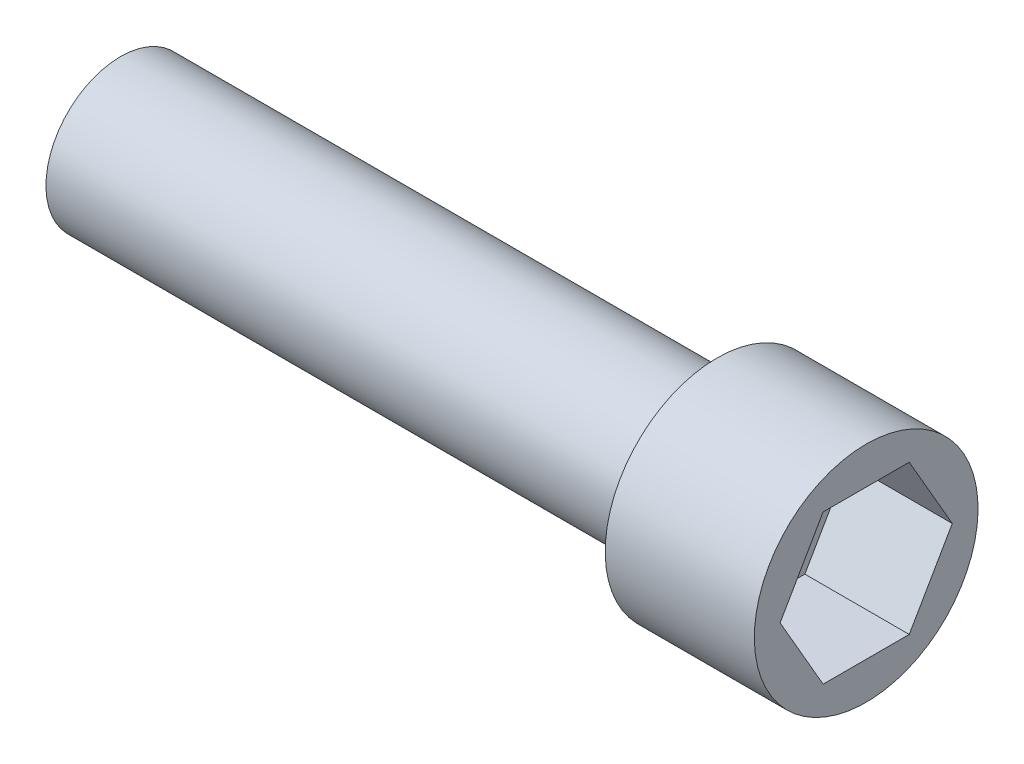
ISO-10303-21;
HEADER;
FILE_DESCRIPTION(('STEP AP214'),'2;1');
FILE_NAME('part.step','',(''),(''),'','','');
FILE_SCHEMA(('AUTOMOTIVE_DESIGN { 1 0 10303 214 1 1 1 1 }'));
ENDSEC;
DATA;
#1=APPLICATION_CONTEXT('core data for automotive mechanical design processes');
#2=APPLICATION_PROTOCOL_DEFINITION('international standard','automotive_design',2000,#1);
#3=PRODUCT_CONTEXT('',#1,'mechanical');
#4=PRODUCT('Part','Part','',(#3));
#5=PRODUCT_RELATED_PRODUCT_CATEGORY('part','',(#4));
#6=PRODUCT_DEFINITION_FORMATION('','',#4);
#7=PRODUCT_DEFINITION_CONTEXT('part definition',#1,'design');
#8=PRODUCT_DEFINITION('design','',#6,#7);
#9=PRODUCT_DEFINITION_SHAPE('','',#8);
#10=(LENGTH_UNIT() NAMED_UNIT(*) SI_UNIT(.MILLI.,.METRE.));
#11=(NAMED_UNIT(*) PLANE_ANGLE_UNIT() SI_UNIT($,.RADIAN.));
#12=(NAMED_UNIT(*) SI_UNIT($,.STERADIAN.) SOLID_ANGLE_UNIT());
#13=UNCERTAINTY_MEASURE_WITH_UNIT(LENGTH_MEASURE(1.E-05),#10,'distance_accuracy_value','');
#14=(GEOMETRIC_REPRESENTATION_CONTEXT(3) GLOBAL_UNCERTAINTY_ASSIGNED_CONTEXT((#13)) GLOBAL_UNIT_ASSIGNED_CONTEXT((#10,
#11,#12)) REPRESENTATION_CONTEXT('',''));
#15=CARTESIAN_POINT('',(0.,0.,0.));
#16=DIRECTION('',(0.,0.,1.));
#17=DIRECTION('',(1.,0.,0.));
#18=AXIS2_PLACEMENT_3D('',#15,#16,#17);
#19=CARTESIAN_POINT('',(0.,0.,0.));
#20=DIRECTION('',(-1.,0.,0.));
#21=DIRECTION('',(0.,-1.,0.));
#22=AXIS2_PLACEMENT_3D('',#19,#20,#21);
#23=PLANE('',#22);
#24=CARTESIAN_POINT('',(0.,0.,0.));
#25=DIRECTION('',(1.,0.,0.));
#26=DIRECTION('',(0.,1.,0.));
#27=AXIS2_PLACEMENT_3D('',#24,#25,#26);
#28=CIRCLE('',#27,5.);
#29=CARTESIAN_POINT('',(0.,5.,0.));
#30=VERTEX_POINT('',#29);
#31=EDGE_CURVE('E11',#30,#30,#28,.T.);
#32=ORIENTED_EDGE('',*,*,#31,.F.);
#33=EDGE_LOOP('',(#32));
#34=FACE_BOUND('',#33,.T.);
#35=ADVANCED_FACE('F41',(#34),#23,.T.);
#36=CARTESIAN_POINT('',(50.,0.,0.));
#37=DIRECTION('',(1.,0.,0.));
#38=DIRECTION('',(0.,1.,0.));
#39=AXIS2_PLACEMENT_3D('',#36,#37,#38);
#40=CYLINDRICAL_SURFACE('',#39,5.);
#41=ORIENTED_EDGE('',*,*,#31,.T.);
#42=EDGE_LOOP('',(#41));
#43=FACE_BOUND('',#42,.T.);
#44=CARTESIAN_POINT('',(40.,0.,0.));
#45=DIRECTION('',(1.,0.,0.));
#46=DIRECTION('',(0.,1.,0.));
#47=AXIS2_PLACEMENT_3D('',#44,#45,#46);
#48=CIRCLE('',#47,5.);
#49=CARTESIAN_POINT('',(40.,5.,0.));
#50=VERTEX_POINT('',#49);
#51=EDGE_CURVE('E48',#50,#50,#48,.T.);
#52=ORIENTED_EDGE('',*,*,#51,.F.);
#53=EDGE_LOOP('',(#52));
#54=FACE_BOUND('',#53,.T.);
#55=ADVANCED_FACE('F158',(#43,#54),#40,.T.);
#56=CARTESIAN_POINT('',(40.,5.,0.));
#57=DIRECTION('',(-1.,0.,0.));
#58=DIRECTION('',(0.,-1.,0.));
#59=AXIS2_PLACEMENT_3D('',#56,#57,#58);
#60=PLANE('',#59);
#61=ORIENTED_EDGE('',*,*,#51,.T.);
#62=EDGE_LOOP('',(#61));
#63=FACE_BOUND('',#62,.T.);
#64=CARTESIAN_POINT('',(40.,0.,0.));
#65=DIRECTION('',(1.,0.,0.));
#66=DIRECTION('',(0.,1.,0.));
#67=AXIS2_PLACEMENT_3D('',#64,#65,#66);
#68=CIRCLE('',#67,7.5);
#69=CARTESIAN_POINT('',(40.,7.5,0.));
#70=VERTEX_POINT('',#69);
#71=EDGE_CURVE('E147',#70,#70,#68,.T.);
#72=ORIENTED_EDGE('',*,*,#71,.F.);
#73=EDGE_LOOP('',(#72));
#74=FACE_BOUND('',#73,.T.);
#75=ADVANCED_FACE('F154',(#63,#74),#60,.T.);
#76=CARTESIAN_POINT('',(50.,0.,0.));
#77=DIRECTION('',(1.,0.,0.));
#78=DIRECTION('',(0.,1.,0.));
#79=AXIS2_PLACEMENT_3D('',#76,#77,#78);
#80=CYLINDRICAL_SURFACE('',#79,7.5);
#81=ORIENTED_EDGE('',*,*,#71,.T.);
#82=EDGE_LOOP('',(#81));
#83=FACE_BOUND('',#82,.T.);
#84=CARTESIAN_POINT('',(50.,0.,0.));
#85=DIRECTION('',(1.,0.,0.));
#86=DIRECTION('',(0.,1.,0.));
#87=AXIS2_PLACEMENT_3D('',#84,#85,#86);
#88=CIRCLE('',#87,7.5);
#89=CARTESIAN_POINT('',(50.,7.5,0.));
#90=VERTEX_POINT('',#89);
#91=EDGE_CURVE('E142',#90,#90,#88,.T.);
#92=ORIENTED_EDGE('',*,*,#91,.F.);
#93=EDGE_LOOP('',(#92));
#94=FACE_BOUND('',#93,.T.);
#95=ADVANCED_FACE('F164',(#83,#94),#80,.T.);
#96=CARTESIAN_POINT('',(50.,7.5,0.));
#97=DIRECTION('',(1.,0.,0.));
#98=DIRECTION('',(0.,1.,0.));
#99=AXIS2_PLACEMENT_3D('',#96,#97,#98);
#100=PLANE('',#99);
#101=DIRECTION('',(0.,0.866025403784439,-0.5));
#102=VECTOR('',#101,1.);
#103=CARTESIAN_POINT('',(50.,-5.,-2.88675134594813));
#104=LINE('',#103,#102);
#105=CARTESIAN_POINT('',(50.,-5.,-2.88675134594813));
#106=VERTEX_POINT('',#105);
#107=CARTESIAN_POINT('',(50.,0.,-5.77350269189626));
#108=VERTEX_POINT('',#107);
#109=EDGE_CURVE('E54',#106,#108,#104,.T.);
#110=ORIENTED_EDGE('',*,*,#109,.F.);
#111=DIRECTION('',(0.,0.,-1.));
#112=VECTOR('',#111,1.);
#113=CARTESIAN_POINT('',(50.,-5.,2.88675134594813));
#114=LINE('',#113,#112);
#115=CARTESIAN_POINT('',(50.,-5.,2.88675134594813));
#116=VERTEX_POINT('',#115);
#117=EDGE_CURVE('E137',#116,#106,#114,.T.);
#118=ORIENTED_EDGE('',*,*,#117,.F.);
#119=DIRECTION('',(0.,-0.866025403784439,-0.5));
#120=VECTOR('',#119,1.);
#121=CARTESIAN_POINT('',(50.,0.,5.77350269189626));
#122=LINE('',#121,#120);
#123=CARTESIAN_POINT('',(50.,0.,5.77350269189626));
#124=VERTEX_POINT('',#123);
#125=EDGE_CURVE('E136',#124,#116,#122,.T.);
#126=ORIENTED_EDGE('',*,*,#125,.F.);
#127=DIRECTION('',(0.,-0.866025403784439,0.5));
#128=VECTOR('',#127,1.);
#129=CARTESIAN_POINT('',(50.,5.00000000000001,2.88675134594813));
#130=LINE('',#129,#128);
#131=CARTESIAN_POINT('',(50.,5.00000000000001,2.88675134594813));
#132=VERTEX_POINT('',#131);
#133=EDGE_CURVE('E103',#132,#124,#130,.T.);
#134=ORIENTED_EDGE('',*,*,#133,.F.);
#135=DIRECTION('',(0.,0.,1.));
#136=VECTOR('',#135,1.);
#137=CARTESIAN_POINT('',(50.,5.00000000000001,-2.88675134594813));
#138=LINE('',#137,#136);
#139=CARTESIAN_POINT('',(50.,5.00000000000001,-2.88675134594813));
#140=VERTEX_POINT('',#139);
#141=EDGE_CURVE('E135',#140,#132,#138,.T.);
#142=ORIENTED_EDGE('',*,*,#141,.F.);
#143=DIRECTION('',(0.,0.866025403784439,0.5));
#144=VECTOR('',#143,1.);
#145=CARTESIAN_POINT('',(50.,0.,-5.77350269189626));
#146=LINE('',#145,#144);
#147=EDGE_CURVE('E129',#108,#140,#146,.T.);
#148=ORIENTED_EDGE('',*,*,#147,.F.);
#149=EDGE_LOOP('',(#110,#118,#126,#134,#142,#148));
#150=FACE_BOUND('',#149,.T.);
#151=ORIENTED_EDGE('',*,*,#91,.T.);
#152=EDGE_LOOP('',(#151));
#153=FACE_BOUND('',#152,.T.);
#154=ADVANCED_FACE('F172',(#150,#153),#100,.T.);
#155=CARTESIAN_POINT('',(43.,-5.,-2.88675134594813));
#156=DIRECTION('',(0.,-0.5,-0.866025403784439));
#157=DIRECTION('',(0.,0.866025403784439,-0.5));
#158=AXIS2_PLACEMENT_3D('',#155,#156,#157);
#159=PLANE('',#158);
#160=ORIENTED_EDGE('',*,*,#109,.T.);
#161=DIRECTION('',(1.,0.,0.));
#162=VECTOR('',#161,1.);
#163=CARTESIAN_POINT('',(43.,0.,-5.77350269189626));
#164=LINE('',#163,#162);
#165=CARTESIAN_POINT('',(43.,0.,-5.77350269189626));
#166=VERTEX_POINT('',#165);
#167=EDGE_CURVE('E84',#166,#108,#164,.T.);
#168=ORIENTED_EDGE('',*,*,#167,.F.);
#169=DIRECTION('',(0.,0.866025403784439,-0.5));
#170=VECTOR('',#169,1.);
#171=CARTESIAN_POINT('',(43.,-5.,-2.88675134594813));
#172=LINE('',#171,#170);
#173=CARTESIAN_POINT('',(43.,-5.,-2.88675134594813));
#174=VERTEX_POINT('',#173);
#175=EDGE_CURVE('E139',#174,#166,#172,.T.);
#176=ORIENTED_EDGE('',*,*,#175,.F.);
#177=DIRECTION('',(1.,0.,0.));
#178=VECTOR('',#177,1.);
#179=CARTESIAN_POINT('',(43.,-5.,-2.88675134594813));
#180=LINE('',#179,#178);
#181=EDGE_CURVE('E64',#174,#106,#180,.T.);
#182=ORIENTED_EDGE('',*,*,#181,.T.);
#183=EDGE_LOOP('',(#160,#168,#176,#182));
#184=FACE_BOUND('',#183,.T.);
#185=ADVANCED_FACE('F173',(#184),#159,.F.);
#186=CARTESIAN_POINT('',(43.,-5.,2.88675134594813));
#187=DIRECTION('',(0.,-1.,0.));
#188=DIRECTION('',(0.,0.,-1.));
#189=AXIS2_PLACEMENT_3D('',#186,#187,#188);
#190=PLANE('',#189);
#191=ORIENTED_EDGE('',*,*,#117,.T.);
#192=ORIENTED_EDGE('',*,*,#181,.F.);
#193=DIRECTION('',(0.,0.,-1.));
#194=VECTOR('',#193,1.);
#195=CARTESIAN_POINT('',(43.,-5.,2.88675134594813));
#196=LINE('',#195,#194);
#197=CARTESIAN_POINT('',(43.,-5.,2.88675134594813));
#198=VERTEX_POINT('',#197);
#199=EDGE_CURVE('E113',#198,#174,#196,.T.);
#200=ORIENTED_EDGE('',*,*,#199,.F.);
#201=DIRECTION('',(1.,0.,0.));
#202=VECTOR('',#201,1.);
#203=CARTESIAN_POINT('',(43.,-5.,2.88675134594813));
#204=LINE('',#203,#202);
#205=EDGE_CURVE('E110',#198,#116,#204,.T.);
#206=ORIENTED_EDGE('',*,*,#205,.T.);
#207=EDGE_LOOP('',(#191,#192,#200,#206));
#208=FACE_BOUND('',#207,.T.);
#209=ADVANCED_FACE('F178',(#208),#190,.F.);
#210=CARTESIAN_POINT('',(43.,0.,5.77350269189626));
#211=DIRECTION('',(0.,-0.5,0.866025403784439));
#212=DIRECTION('',(0.,-0.866025403784438,-0.5));
#213=AXIS2_PLACEMENT_3D('',#210,#211,#212);
#214=PLANE('',#213);
#215=ORIENTED_EDGE('',*,*,#125,.T.);
#216=ORIENTED_EDGE('',*,*,#205,.F.);
#217=DIRECTION('',(0.,-0.866025403784439,-0.5));
#218=VECTOR('',#217,1.);
#219=CARTESIAN_POINT('',(43.,0.,5.77350269189626));
#220=LINE('',#219,#218);
#221=CARTESIAN_POINT('',(43.,0.,5.77350269189626));
#222=VERTEX_POINT('',#221);
#223=EDGE_CURVE('E112',#222,#198,#220,.T.);
#224=ORIENTED_EDGE('',*,*,#223,.F.);
#225=DIRECTION('',(1.,0.,0.));
#226=VECTOR('',#225,1.);
#227=CARTESIAN_POINT('',(43.,0.,5.77350269189626));
#228=LINE('',#227,#226);
#229=EDGE_CURVE('E96',#222,#124,#228,.T.);
#230=ORIENTED_EDGE('',*,*,#229,.T.);
#231=EDGE_LOOP('',(#215,#216,#224,#230));
#232=FACE_BOUND('',#231,.T.);
#233=ADVANCED_FACE('F115',(#232),#214,.F.);
#234=CARTESIAN_POINT('',(43.,5.00000000000001,2.88675134594813));
#235=DIRECTION('',(0.,0.5,0.866025403784439));
#236=DIRECTION('',(0.,-0.866025403784439,0.5));
#237=AXIS2_PLACEMENT_3D('',#234,#235,#236);
#238=PLANE('',#237);
#239=ORIENTED_EDGE('',*,*,#133,.T.);
#240=ORIENTED_EDGE('',*,*,#229,.F.);
#241=DIRECTION('',(0.,-0.866025403784439,0.5));
#242=VECTOR('',#241,1.);
#243=CARTESIAN_POINT('',(43.,5.00000000000001,2.88675134594813));
#244=LINE('',#243,#242);
#245=CARTESIAN_POINT('',(43.,5.00000000000001,2.88675134594813));
#246=VERTEX_POINT('',#245);
#247=EDGE_CURVE('E99',#246,#222,#244,.T.);
#248=ORIENTED_EDGE('',*,*,#247,.F.);
#249=DIRECTION('',(1.,0.,0.));
#250=VECTOR('',#249,1.);
#251=CARTESIAN_POINT('',(43.,5.00000000000001,2.88675134594813));
#252=LINE('',#251,#250);
#253=EDGE_CURVE('E107',#246,#132,#252,.T.);
#254=ORIENTED_EDGE('',*,*,#253,.T.);
#255=EDGE_LOOP('',(#239,#240,#248,#254));
#256=FACE_BOUND('',#255,.T.);
#257=ADVANCED_FACE('F98',(#256),#238,.F.);
#258=CARTESIAN_POINT('',(43.,5.00000000000001,-2.88675134594813));
#259=DIRECTION('',(0.,1.,0.));
#260=DIRECTION('',(-1.,0.,0.));
#261=AXIS2_PLACEMENT_3D('',#258,#259,#260);
#262=PLANE('',#261);
#263=ORIENTED_EDGE('',*,*,#141,.T.);
#264=ORIENTED_EDGE('',*,*,#253,.F.);
#265=DIRECTION('',(0.,0.,1.));
#266=VECTOR('',#265,1.);
#267=CARTESIAN_POINT('',(43.,5.00000000000001,-2.88675134594813));
#268=LINE('',#267,#266);
#269=CARTESIAN_POINT('',(43.,5.00000000000001,-2.88675134594813));
#270=VERTEX_POINT('',#269);
#271=EDGE_CURVE('E121',#270,#246,#268,.T.);
#272=ORIENTED_EDGE('',*,*,#271,.F.);
#273=DIRECTION('',(1.,0.,0.));
#274=VECTOR('',#273,1.);
#275=CARTESIAN_POINT('',(43.,5.00000000000001,-2.88675134594813));
#276=LINE('',#275,#274);
#277=EDGE_CURVE('E144',#270,#140,#276,.T.);
#278=ORIENTED_EDGE('',*,*,#277,.T.);
#279=EDGE_LOOP('',(#263,#264,#272,#278));
#280=FACE_BOUND('',#279,.T.);
#281=ADVANCED_FACE('F181',(#280),#262,.F.);
#282=CARTESIAN_POINT('',(43.,0.,-5.77350269189626));
#283=DIRECTION('',(0.,0.5,-0.866025403784439));
#284=DIRECTION('',(0.,0.866025403784439,0.5));
#285=AXIS2_PLACEMENT_3D('',#282,#283,#284);
#286=PLANE('',#285);
#287=ORIENTED_EDGE('',*,*,#147,.T.);
#288=ORIENTED_EDGE('',*,*,#277,.F.);
#289=DIRECTION('',(0.,0.866025403784439,0.5));
#290=VECTOR('',#289,1.);
#291=CARTESIAN_POINT('',(43.,0.,-5.77350269189626));
#292=LINE('',#291,#290);
#293=EDGE_CURVE('E122',#166,#270,#292,.T.);
#294=ORIENTED_EDGE('',*,*,#293,.F.);
#295=ORIENTED_EDGE('',*,*,#167,.T.);
#296=EDGE_LOOP('',(#287,#288,#294,#295));
#297=FACE_BOUND('',#296,.T.);
#298=ADVANCED_FACE('F179',(#297),#286,.F.);
#299=CARTESIAN_POINT('',(43.,0.,0.));
#300=DIRECTION('',(1.,0.,0.));
#301=DIRECTION('',(0.,0.,-1.));
#302=AXIS2_PLACEMENT_3D('',#299,#300,#301);
#303=PLANE('',#302);
#304=ORIENTED_EDGE('',*,*,#175,.T.);
#305=ORIENTED_EDGE('',*,*,#293,.T.);
#306=ORIENTED_EDGE('',*,*,#271,.T.);
#307=ORIENTED_EDGE('',*,*,#247,.T.);
#308=ORIENTED_EDGE('',*,*,#223,.T.);
#309=ORIENTED_EDGE('',*,*,#199,.T.);
#310=EDGE_LOOP('',(#304,#305,#306,#307,#308,#309));
#311=FACE_BOUND('',#310,.T.);
#312=ADVANCED_FACE('F119',(#311),#303,.T.);
#313=CLOSED_SHELL('',(#35,#55,#75,#95,#154,#185,#209,#233,#257,#281,#298,#312));
#314=MANIFOLD_SOLID_BREP('B2',#313);
#315=ADVANCED_BREP_SHAPE_REPRESENTATION('',(#18,#314),#14);
#316=SHAPE_DEFINITION_REPRESENTATION(#9,#315);
ENDSEC;
END-ISO-10303-21;
